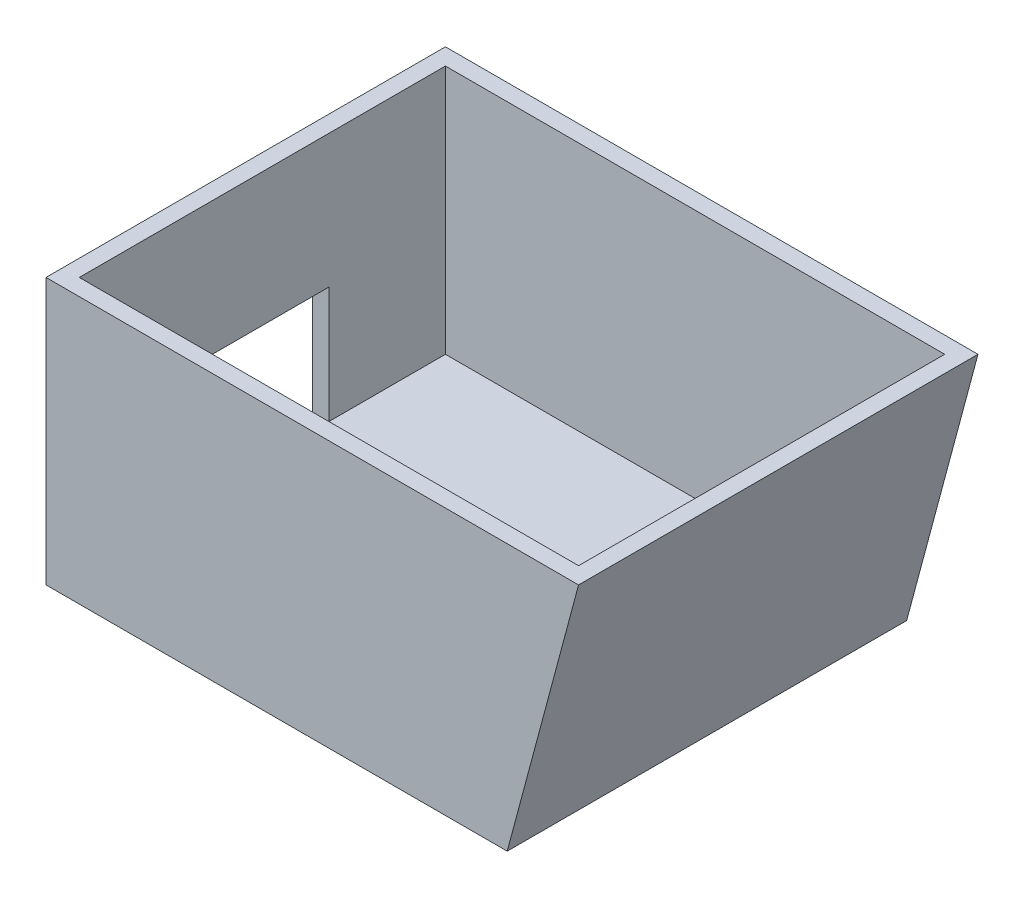
ISO-10303-21;
HEADER;
FILE_DESCRIPTION(('STEP AP214'),'2;1');
FILE_NAME('part.step','',(''),(''),'','','');
FILE_SCHEMA(('AUTOMOTIVE_DESIGN { 1 0 10303 214 1 1 1 1 }'));
ENDSEC;
DATA;
#1=APPLICATION_CONTEXT('core data for automotive mechanical design processes');
#2=APPLICATION_PROTOCOL_DEFINITION('international standard','automotive_design',2000,#1);
#3=PRODUCT_CONTEXT('',#1,'mechanical');
#4=PRODUCT('Part','Part','',(#3));
#5=PRODUCT_RELATED_PRODUCT_CATEGORY('part','',(#4));
#6=PRODUCT_DEFINITION_FORMATION('','',#4);
#7=PRODUCT_DEFINITION_CONTEXT('part definition',#1,'design');
#8=PRODUCT_DEFINITION('design','',#6,#7);
#9=PRODUCT_DEFINITION_SHAPE('','',#8);
#10=(LENGTH_UNIT() NAMED_UNIT(*) SI_UNIT(.MILLI.,.METRE.));
#11=(NAMED_UNIT(*) PLANE_ANGLE_UNIT() SI_UNIT($,.RADIAN.));
#12=(NAMED_UNIT(*) SI_UNIT($,.STERADIAN.) SOLID_ANGLE_UNIT());
#13=UNCERTAINTY_MEASURE_WITH_UNIT(LENGTH_MEASURE(1.E-05),#10,'distance_accuracy_value','');
#14=(GEOMETRIC_REPRESENTATION_CONTEXT(3) GLOBAL_UNCERTAINTY_ASSIGNED_CONTEXT((#13)) GLOBAL_UNIT_ASSIGNED_CONTEXT((#10,
#11,#12)) REPRESENTATION_CONTEXT('',''));
#15=CARTESIAN_POINT('',(0.,0.,0.));
#16=DIRECTION('',(0.,0.,1.));
#17=DIRECTION('',(1.,0.,0.));
#18=AXIS2_PLACEMENT_3D('',#15,#16,#17);
#19=CARTESIAN_POINT('',(-50.8,50.8,-38.1));
#20=DIRECTION('',(0.,0.,1.));
#21=DIRECTION('',(1.,0.,0.));
#22=AXIS2_PLACEMENT_3D('',#19,#20,#21);
#23=PLANE('',#22);
#24=DIRECTION('',(-1.,0.,0.));
#25=VECTOR('',#24,1.);
#26=CARTESIAN_POINT('',(-50.8,50.8,-38.1));
#27=LINE('',#26,#25);
#28=CARTESIAN_POINT('',(50.8,50.8,-38.1));
#29=VERTEX_POINT('',#28);
#30=CARTESIAN_POINT('',(-50.8,50.8,-38.1));
#31=VERTEX_POINT('',#30);
#32=EDGE_CURVE('E232',#29,#31,#27,.T.);
#33=ORIENTED_EDGE('',*,*,#32,.F.);
#34=DIRECTION('',(-0.258819045102521,-0.965925826289068,0.));
#35=VECTOR('',#34,1.);
#36=CARTESIAN_POINT('',(37.188181024499,0.,-38.1));
#37=LINE('',#36,#35);
#38=CARTESIAN_POINT('',(37.188181024499,0.,-38.1));
#39=VERTEX_POINT('',#38);
#40=EDGE_CURVE('E217',#29,#39,#37,.T.);
#41=ORIENTED_EDGE('',*,*,#40,.T.);
#42=DIRECTION('',(-1.,0.,0.));
#43=VECTOR('',#42,1.);
#44=CARTESIAN_POINT('',(-50.8,0.,-38.1));
#45=LINE('',#44,#43);
#46=CARTESIAN_POINT('',(-50.8,0.,-38.1));
#47=VERTEX_POINT('',#46);
#48=EDGE_CURVE('E228',#39,#47,#45,.T.);
#49=ORIENTED_EDGE('',*,*,#48,.T.);
#50=DIRECTION('',(0.,-1.,0.));
#51=VECTOR('',#50,1.);
#52=CARTESIAN_POINT('',(-50.8,50.8,-38.1));
#53=LINE('',#52,#51);
#54=EDGE_CURVE('E253',#31,#47,#53,.T.);
#55=ORIENTED_EDGE('',*,*,#54,.F.);
#56=EDGE_LOOP('',(#33,#41,#49,#55));
#57=FACE_BOUND('',#56,.T.);
#58=ADVANCED_FACE('F39',(#57),#23,.F.);
#59=CARTESIAN_POINT('',(-50.8,50.8,-38.1));
#60=DIRECTION('',(1.,0.,0.));
#61=DIRECTION('',(0.,0.,-1.));
#62=AXIS2_PLACEMENT_3D('',#59,#60,#61);
#63=PLANE('',#62);
#64=DIRECTION('',(0.,0.,-1.));
#65=VECTOR('',#64,1.);
#66=CARTESIAN_POINT('',(-50.8,25.4,12.7));
#67=LINE('',#66,#65);
#68=CARTESIAN_POINT('',(-50.8,25.4,12.7));
#69=VERTEX_POINT('',#68);
#70=CARTESIAN_POINT('',(-50.8,25.4,-12.7));
#71=VERTEX_POINT('',#70);
#72=EDGE_CURVE('E143',#69,#71,#67,.T.);
#73=ORIENTED_EDGE('',*,*,#72,.F.);
#74=DIRECTION('',(0.,-1.,0.));
#75=VECTOR('',#74,1.);
#76=CARTESIAN_POINT('',(-50.8,25.4,12.7));
#77=LINE('',#76,#75);
#78=CARTESIAN_POINT('',(-50.8,0.,12.7));
#79=VERTEX_POINT('',#78);
#80=EDGE_CURVE('E173',#69,#79,#77,.T.);
#81=ORIENTED_EDGE('',*,*,#80,.T.);
#82=DIRECTION('',(0.,0.,1.));
#83=VECTOR('',#82,1.);
#84=CARTESIAN_POINT('',(-50.8,0.,-38.1));
#85=LINE('',#84,#83);
#86=CARTESIAN_POINT('',(-50.8,0.,38.1));
#87=VERTEX_POINT('',#86);
#88=EDGE_CURVE('E245',#79,#87,#85,.T.);
#89=ORIENTED_EDGE('',*,*,#88,.T.);
#90=DIRECTION('',(0.,-1.,0.));
#91=VECTOR('',#90,1.);
#92=CARTESIAN_POINT('',(-50.8,50.8,38.1));
#93=LINE('',#92,#91);
#94=CARTESIAN_POINT('',(-50.8,50.8,38.1));
#95=VERTEX_POINT('',#94);
#96=EDGE_CURVE('E242',#95,#87,#93,.T.);
#97=ORIENTED_EDGE('',*,*,#96,.F.);
#98=DIRECTION('',(0.,0.,1.));
#99=VECTOR('',#98,1.);
#100=CARTESIAN_POINT('',(-50.8,50.8,-38.1));
#101=LINE('',#100,#99);
#102=EDGE_CURVE('E236',#31,#95,#101,.T.);
#103=ORIENTED_EDGE('',*,*,#102,.F.);
#104=ORIENTED_EDGE('',*,*,#54,.T.);
#105=CARTESIAN_POINT('',(-50.8,0.,-12.7));
#106=VERTEX_POINT('',#105);
#107=EDGE_CURVE('E158',#47,#106,#85,.T.);
#108=ORIENTED_EDGE('',*,*,#107,.T.);
#109=DIRECTION('',(0.,-1.,0.));
#110=VECTOR('',#109,1.);
#111=CARTESIAN_POINT('',(-50.8,25.4,-12.7));
#112=LINE('',#111,#110);
#113=EDGE_CURVE('E54',#71,#106,#112,.T.);
#114=ORIENTED_EDGE('',*,*,#113,.F.);
#115=EDGE_LOOP('',(#73,#81,#89,#97,#103,#104,#108,#114));
#116=FACE_BOUND('',#115,.T.);
#117=ADVANCED_FACE('F155',(#116),#63,.F.);
#118=CARTESIAN_POINT('',(-50.8,50.8,38.1));
#119=DIRECTION('',(0.,0.,-1.));
#120=DIRECTION('',(-1.,0.,0.));
#121=AXIS2_PLACEMENT_3D('',#118,#119,#120);
#122=PLANE('',#121);
#123=DIRECTION('',(1.,0.,0.));
#124=VECTOR('',#123,1.);
#125=CARTESIAN_POINT('',(-50.8,0.,38.1));
#126=LINE('',#125,#124);
#127=CARTESIAN_POINT('',(37.1881810244989,0.,38.1));
#128=VERTEX_POINT('',#127);
#129=EDGE_CURVE('E233',#87,#128,#126,.T.);
#130=ORIENTED_EDGE('',*,*,#129,.T.);
#131=DIRECTION('',(-0.258819045102521,-0.965925826289068,0.));
#132=VECTOR('',#131,1.);
#133=CARTESIAN_POINT('',(37.188181024499,0.,38.1));
#134=LINE('',#133,#132);
#135=CARTESIAN_POINT('',(50.8,50.8,38.1));
#136=VERTEX_POINT('',#135);
#137=EDGE_CURVE('E213',#136,#128,#134,.T.);
#138=ORIENTED_EDGE('',*,*,#137,.F.);
#139=DIRECTION('',(1.,0.,0.));
#140=VECTOR('',#139,1.);
#141=CARTESIAN_POINT('',(-50.8,50.8,38.1));
#142=LINE('',#141,#140);
#143=EDGE_CURVE('E239',#95,#136,#142,.T.);
#144=ORIENTED_EDGE('',*,*,#143,.F.);
#145=ORIENTED_EDGE('',*,*,#96,.T.);
#146=EDGE_LOOP('',(#130,#138,#144,#145));
#147=FACE_BOUND('',#146,.T.);
#148=ADVANCED_FACE('F305',(#147),#122,.F.);
#149=CARTESIAN_POINT('',(0.,50.8,0.));
#150=DIRECTION('',(0.,1.,0.));
#151=DIRECTION('',(0.,0.,1.));
#152=AXIS2_PLACEMENT_3D('',#149,#150,#151);
#153=PLANE('',#152);
#154=ORIENTED_EDGE('',*,*,#143,.T.);
#155=DIRECTION('',(0.,0.,-1.));
#156=VECTOR('',#155,1.);
#157=CARTESIAN_POINT('',(50.8,50.8,-38.1));
#158=LINE('',#157,#156);
#159=EDGE_CURVE('E229',#136,#29,#158,.T.);
#160=ORIENTED_EDGE('',*,*,#159,.T.);
#161=ORIENTED_EDGE('',*,*,#32,.T.);
#162=ORIENTED_EDGE('',*,*,#102,.T.);
#163=EDGE_LOOP('',(#154,#160,#161,#162));
#164=FACE_BOUND('',#163,.T.);
#165=DIRECTION('',(0.,0.,-1.));
#166=VECTOR('',#165,1.);
#167=CARTESIAN_POINT('',(47.625,50.8,34.925));
#168=LINE('',#167,#166);
#169=CARTESIAN_POINT('',(47.625,50.8,34.925));
#170=VERTEX_POINT('',#169);
#171=CARTESIAN_POINT('',(47.625,50.8,-34.925));
#172=VERTEX_POINT('',#171);
#173=EDGE_CURVE('E202',#170,#172,#168,.T.);
#174=ORIENTED_EDGE('',*,*,#173,.F.);
#175=DIRECTION('',(1.,0.,0.));
#176=VECTOR('',#175,1.);
#177=CARTESIAN_POINT('',(-47.625,50.8,34.925));
#178=LINE('',#177,#176);
#179=CARTESIAN_POINT('',(-47.625,50.8,34.925));
#180=VERTEX_POINT('',#179);
#181=EDGE_CURVE('E199',#180,#170,#178,.T.);
#182=ORIENTED_EDGE('',*,*,#181,.F.);
#183=DIRECTION('',(0.,0.,1.));
#184=VECTOR('',#183,1.);
#185=CARTESIAN_POINT('',(-47.625,50.8,-34.925));
#186=LINE('',#185,#184);
#187=CARTESIAN_POINT('',(-47.625,50.8,-34.925));
#188=VERTEX_POINT('',#187);
#189=EDGE_CURVE('E184',#188,#180,#186,.T.);
#190=ORIENTED_EDGE('',*,*,#189,.F.);
#191=DIRECTION('',(-1.,0.,0.));
#192=VECTOR('',#191,1.);
#193=CARTESIAN_POINT('',(47.625,50.8,-34.925));
#194=LINE('',#193,#192);
#195=EDGE_CURVE('E206',#172,#188,#194,.T.);
#196=ORIENTED_EDGE('',*,*,#195,.F.);
#197=EDGE_LOOP('',(#174,#182,#190,#196));
#198=FACE_BOUND('',#197,.T.);
#199=ADVANCED_FACE('F310',(#164,#198),#153,.T.);
#200=CARTESIAN_POINT('',(0.,0.,0.));
#201=DIRECTION('',(0.,1.,0.));
#202=DIRECTION('',(0.,0.,1.));
#203=AXIS2_PLACEMENT_3D('',#200,#201,#202);
#204=PLANE('',#203);
#205=ORIENTED_EDGE('',*,*,#88,.F.);
#206=DIRECTION('',(-1.,0.,0.));
#207=VECTOR('',#206,1.);
#208=CARTESIAN_POINT('',(-50.8,0.,12.7));
#209=LINE('',#208,#207);
#210=CARTESIAN_POINT('',(-25.4,0.,12.7));
#211=VERTEX_POINT('',#210);
#212=EDGE_CURVE('E152',#211,#79,#209,.T.);
#213=ORIENTED_EDGE('',*,*,#212,.F.);
#214=DIRECTION('',(0.,0.,1.));
#215=VECTOR('',#214,1.);
#216=CARTESIAN_POINT('',(-25.4,0.,12.7));
#217=LINE('',#216,#215);
#218=CARTESIAN_POINT('',(-25.4,0.,-12.7));
#219=VERTEX_POINT('',#218);
#220=EDGE_CURVE('E286',#219,#211,#217,.T.);
#221=ORIENTED_EDGE('',*,*,#220,.F.);
#222=DIRECTION('',(1.,0.,0.));
#223=VECTOR('',#222,1.);
#224=CARTESIAN_POINT('',(-50.8,0.,-12.7));
#225=LINE('',#224,#223);
#226=EDGE_CURVE('E282',#106,#219,#225,.T.);
#227=ORIENTED_EDGE('',*,*,#226,.F.);
#228=ORIENTED_EDGE('',*,*,#107,.F.);
#229=ORIENTED_EDGE('',*,*,#48,.F.);
#230=DIRECTION('',(0.,0.,1.));
#231=VECTOR('',#230,1.);
#232=CARTESIAN_POINT('',(37.188181024499,0.,-38.1));
#233=LINE('',#232,#231);
#234=EDGE_CURVE('E221',#39,#128,#233,.T.);
#235=ORIENTED_EDGE('',*,*,#234,.T.);
#236=ORIENTED_EDGE('',*,*,#129,.F.);
#237=EDGE_LOOP('',(#205,#213,#221,#227,#228,#229,#235,#236));
#238=FACE_BOUND('',#237,.T.);
#239=ADVANCED_FACE('F290',(#238),#204,.F.);
#240=CARTESIAN_POINT('',(37.188181024499,0.,-38.1));
#241=DIRECTION('',(-0.965925826289068,0.258819045102521,0.));
#242=DIRECTION('',(-0.258819045102521,-0.965925826289068,0.));
#243=AXIS2_PLACEMENT_3D('',#240,#241,#242);
#244=PLANE('',#243);
#245=ORIENTED_EDGE('',*,*,#40,.F.);
#246=ORIENTED_EDGE('',*,*,#159,.F.);
#247=ORIENTED_EDGE('',*,*,#137,.T.);
#248=ORIENTED_EDGE('',*,*,#234,.F.);
#249=EDGE_LOOP('',(#245,#246,#247,#248));
#250=FACE_BOUND('',#249,.T.);
#251=ADVANCED_FACE('F317',(#250),#244,.F.);
#252=CARTESIAN_POINT('',(47.625,3.175,-34.925));
#253=DIRECTION('',(0.,0.,-1.));
#254=DIRECTION('',(-1.,0.,0.));
#255=AXIS2_PLACEMENT_3D('',#252,#253,#254);
#256=PLANE('',#255);
#257=DIRECTION('',(-1.,0.,0.));
#258=VECTOR('',#257,1.);
#259=CARTESIAN_POINT('',(47.625,3.175,-34.925));
#260=LINE('',#259,#258);
#261=CARTESIAN_POINT('',(34.8639197104678,3.175,-34.925));
#262=VERTEX_POINT('',#261);
#263=CARTESIAN_POINT('',(-47.625,3.175,-34.925));
#264=VERTEX_POINT('',#263);
#265=EDGE_CURVE('E193',#262,#264,#260,.T.);
#266=ORIENTED_EDGE('',*,*,#265,.F.);
#267=DIRECTION('',(-0.258819045102521,-0.965925826289068,0.));
#268=VECTOR('',#267,1.);
#269=CARTESIAN_POINT('',(47.625,50.8,-34.925));
#270=LINE('',#269,#268);
#271=EDGE_CURVE('E176',#172,#262,#270,.T.);
#272=ORIENTED_EDGE('',*,*,#271,.F.);
#273=ORIENTED_EDGE('',*,*,#195,.T.);
#274=DIRECTION('',(0.,1.,0.));
#275=VECTOR('',#274,1.);
#276=CARTESIAN_POINT('',(-47.625,3.175,-34.925));
#277=LINE('',#276,#275);
#278=EDGE_CURVE('E210',#264,#188,#277,.T.);
#279=ORIENTED_EDGE('',*,*,#278,.F.);
#280=EDGE_LOOP('',(#266,#272,#273,#279));
#281=FACE_BOUND('',#280,.T.);
#282=ADVANCED_FACE('F319',(#281),#256,.F.);
#283=CARTESIAN_POINT('',(-47.625,3.175,34.925));
#284=DIRECTION('',(0.,0.,1.));
#285=DIRECTION('',(1.,0.,0.));
#286=AXIS2_PLACEMENT_3D('',#283,#284,#285);
#287=PLANE('',#286);
#288=ORIENTED_EDGE('',*,*,#181,.T.);
#289=DIRECTION('',(-0.258819045102521,-0.965925826289068,0.));
#290=VECTOR('',#289,1.);
#291=CARTESIAN_POINT('',(29.3382098552339,-17.447229927617,34.925));
#292=LINE('',#291,#290);
#293=CARTESIAN_POINT('',(34.8639197104678,3.175,34.925));
#294=VERTEX_POINT('',#293);
#295=EDGE_CURVE('E180',#170,#294,#292,.T.);
#296=ORIENTED_EDGE('',*,*,#295,.T.);
#297=DIRECTION('',(1.,0.,0.));
#298=VECTOR('',#297,1.);
#299=CARTESIAN_POINT('',(-47.625,3.175,34.925));
#300=LINE('',#299,#298);
#301=CARTESIAN_POINT('',(-47.625,3.175,34.925));
#302=VERTEX_POINT('',#301);
#303=EDGE_CURVE('E189',#302,#294,#300,.T.);
#304=ORIENTED_EDGE('',*,*,#303,.F.);
#305=DIRECTION('',(0.,1.,0.));
#306=VECTOR('',#305,1.);
#307=CARTESIAN_POINT('',(-47.625,3.175,34.925));
#308=LINE('',#307,#306);
#309=EDGE_CURVE('E196',#302,#180,#308,.T.);
#310=ORIENTED_EDGE('',*,*,#309,.T.);
#311=EDGE_LOOP('',(#288,#296,#304,#310));
#312=FACE_BOUND('',#311,.T.);
#313=ADVANCED_FACE('F325',(#312),#287,.F.);
#314=CARTESIAN_POINT('',(0.,3.175,0.));
#315=DIRECTION('',(0.,1.,0.));
#316=DIRECTION('',(0.,0.,1.));
#317=AXIS2_PLACEMENT_3D('',#314,#315,#316);
#318=PLANE('',#317);
#319=DIRECTION('',(1.,0.,0.));
#320=VECTOR('',#319,1.);
#321=CARTESIAN_POINT('',(0.,3.175,12.7));
#322=LINE('',#321,#320);
#323=CARTESIAN_POINT('',(-47.625,3.175,12.7));
#324=VERTEX_POINT('',#323);
#325=CARTESIAN_POINT('',(-25.4,3.175,12.7));
#326=VERTEX_POINT('',#325);
#327=EDGE_CURVE('E172',#324,#326,#322,.T.);
#328=ORIENTED_EDGE('',*,*,#327,.F.);
#329=DIRECTION('',(0.,0.,1.));
#330=VECTOR('',#329,1.);
#331=CARTESIAN_POINT('',(-47.625,3.175,-34.925));
#332=LINE('',#331,#330);
#333=EDGE_CURVE('E190',#324,#302,#332,.T.);
#334=ORIENTED_EDGE('',*,*,#333,.T.);
#335=ORIENTED_EDGE('',*,*,#303,.T.);
#336=DIRECTION('',(0.,0.,1.));
#337=VECTOR('',#336,1.);
#338=CARTESIAN_POINT('',(34.8639197104678,3.175,0.));
#339=LINE('',#338,#337);
#340=EDGE_CURVE('E256',#262,#294,#339,.T.);
#341=ORIENTED_EDGE('',*,*,#340,.F.);
#342=ORIENTED_EDGE('',*,*,#265,.T.);
#343=CARTESIAN_POINT('',(-47.625,3.175,-12.7));
#344=VERTEX_POINT('',#343);
#345=EDGE_CURVE('E185',#264,#344,#332,.T.);
#346=ORIENTED_EDGE('',*,*,#345,.T.);
#347=DIRECTION('',(-1.,0.,0.));
#348=VECTOR('',#347,1.);
#349=CARTESIAN_POINT('',(0.,3.175,-12.7));
#350=LINE('',#349,#348);
#351=CARTESIAN_POINT('',(-25.4,3.175,-12.7));
#352=VERTEX_POINT('',#351);
#353=EDGE_CURVE('E169',#352,#344,#350,.T.);
#354=ORIENTED_EDGE('',*,*,#353,.F.);
#355=DIRECTION('',(0.,0.,-1.));
#356=VECTOR('',#355,1.);
#357=CARTESIAN_POINT('',(-25.4,3.175,0.));
#358=LINE('',#357,#356);
#359=EDGE_CURVE('E11',#326,#352,#358,.T.);
#360=ORIENTED_EDGE('',*,*,#359,.F.);
#361=EDGE_LOOP('',(#328,#334,#335,#341,#342,#346,#354,#360));
#362=FACE_BOUND('',#361,.T.);
#363=ADVANCED_FACE('F276',(#362),#318,.T.);
#364=CARTESIAN_POINT('',(-47.625,3.175,-34.925));
#365=DIRECTION('',(-1.,0.,0.));
#366=DIRECTION('',(0.,0.,1.));
#367=AXIS2_PLACEMENT_3D('',#364,#365,#366);
#368=PLANE('',#367);
#369=ORIENTED_EDGE('',*,*,#333,.F.);
#370=DIRECTION('',(0.,1.,0.));
#371=VECTOR('',#370,1.);
#372=CARTESIAN_POINT('',(-47.625,3.175,12.7));
#373=LINE('',#372,#371);
#374=CARTESIAN_POINT('',(-47.625,25.4,12.7));
#375=VERTEX_POINT('',#374);
#376=EDGE_CURVE('E47',#324,#375,#373,.T.);
#377=ORIENTED_EDGE('',*,*,#376,.T.);
#378=DIRECTION('',(0.,0.,1.));
#379=VECTOR('',#378,1.);
#380=CARTESIAN_POINT('',(-47.625,25.4,-34.925));
#381=LINE('',#380,#379);
#382=CARTESIAN_POINT('',(-47.625,25.4,-12.7));
#383=VERTEX_POINT('',#382);
#384=EDGE_CURVE('E260',#383,#375,#381,.T.);
#385=ORIENTED_EDGE('',*,*,#384,.F.);
#386=DIRECTION('',(0.,-1.,0.));
#387=VECTOR('',#386,1.);
#388=CARTESIAN_POINT('',(-47.625,3.175,-12.7));
#389=LINE('',#388,#387);
#390=EDGE_CURVE('E139',#383,#344,#389,.T.);
#391=ORIENTED_EDGE('',*,*,#390,.T.);
#392=ORIENTED_EDGE('',*,*,#345,.F.);
#393=ORIENTED_EDGE('',*,*,#278,.T.);
#394=ORIENTED_EDGE('',*,*,#189,.T.);
#395=ORIENTED_EDGE('',*,*,#309,.F.);
#396=EDGE_LOOP('',(#369,#377,#385,#391,#392,#393,#394,#395));
#397=FACE_BOUND('',#396,.T.);
#398=ADVANCED_FACE('F268',(#397),#368,.F.);
#399=CARTESIAN_POINT('',(47.625,50.8,-34.925));
#400=DIRECTION('',(-0.965925826289068,0.258819045102521,0.));
#401=DIRECTION('',(-0.258819045102521,-0.965925826289068,0.));
#402=AXIS2_PLACEMENT_3D('',#399,#400,#401);
#403=PLANE('',#402);
#404=ORIENTED_EDGE('',*,*,#295,.F.);
#405=ORIENTED_EDGE('',*,*,#173,.T.);
#406=ORIENTED_EDGE('',*,*,#271,.T.);
#407=ORIENTED_EDGE('',*,*,#340,.T.);
#408=EDGE_LOOP('',(#404,#405,#406,#407));
#409=FACE_BOUND('',#408,.T.);
#410=ADVANCED_FACE('F371',(#409),#403,.T.);
#411=CARTESIAN_POINT('',(0.,25.4,0.));
#412=DIRECTION('',(0.,-1.,0.));
#413=DIRECTION('',(0.,0.,-1.));
#414=AXIS2_PLACEMENT_3D('',#411,#412,#413);
#415=PLANE('',#414);
#416=ORIENTED_EDGE('',*,*,#384,.T.);
#417=DIRECTION('',(-1.,0.,0.));
#418=VECTOR('',#417,1.);
#419=CARTESIAN_POINT('',(-50.8,25.4,12.7));
#420=LINE('',#419,#418);
#421=EDGE_CURVE('E142',#375,#69,#420,.T.);
#422=ORIENTED_EDGE('',*,*,#421,.T.);
#423=ORIENTED_EDGE('',*,*,#72,.T.);
#424=DIRECTION('',(1.,0.,0.));
#425=VECTOR('',#424,1.);
#426=CARTESIAN_POINT('',(-50.8,25.4,-12.7));
#427=LINE('',#426,#425);
#428=EDGE_CURVE('E61',#71,#383,#427,.T.);
#429=ORIENTED_EDGE('',*,*,#428,.T.);
#430=EDGE_LOOP('',(#416,#422,#423,#429));
#431=FACE_BOUND('',#430,.T.);
#432=ADVANCED_FACE('F146',(#431),#415,.T.);
#433=CARTESIAN_POINT('',(-50.8,25.4,12.7));
#434=DIRECTION('',(0.,0.,1.));
#435=DIRECTION('',(1.,0.,0.));
#436=AXIS2_PLACEMENT_3D('',#433,#434,#435);
#437=PLANE('',#436);
#438=ORIENTED_EDGE('',*,*,#327,.T.);
#439=DIRECTION('',(0.,-1.,0.));
#440=VECTOR('',#439,1.);
#441=CARTESIAN_POINT('',(-25.4,25.4,12.7));
#442=LINE('',#441,#440);
#443=EDGE_CURVE('E164',#326,#211,#442,.T.);
#444=ORIENTED_EDGE('',*,*,#443,.T.);
#445=ORIENTED_EDGE('',*,*,#212,.T.);
#446=ORIENTED_EDGE('',*,*,#80,.F.);
#447=ORIENTED_EDGE('',*,*,#421,.F.);
#448=ORIENTED_EDGE('',*,*,#376,.F.);
#449=EDGE_LOOP('',(#438,#444,#445,#446,#447,#448));
#450=FACE_BOUND('',#449,.T.);
#451=ADVANCED_FACE('F272',(#450),#437,.F.);
#452=CARTESIAN_POINT('',(-25.4,25.4,12.7));
#453=DIRECTION('',(1.,0.,0.));
#454=DIRECTION('',(0.,0.,-1.));
#455=AXIS2_PLACEMENT_3D('',#452,#453,#454);
#456=PLANE('',#455);
#457=ORIENTED_EDGE('',*,*,#359,.T.);
#458=DIRECTION('',(0.,-1.,0.));
#459=VECTOR('',#458,1.);
#460=CARTESIAN_POINT('',(-25.4,25.4,-12.7));
#461=LINE('',#460,#459);
#462=EDGE_CURVE('E160',#352,#219,#461,.T.);
#463=ORIENTED_EDGE('',*,*,#462,.T.);
#464=ORIENTED_EDGE('',*,*,#220,.T.);
#465=ORIENTED_EDGE('',*,*,#443,.F.);
#466=EDGE_LOOP('',(#457,#463,#464,#465));
#467=FACE_BOUND('',#466,.T.);
#468=ADVANCED_FACE('F280',(#467),#456,.F.);
#469=CARTESIAN_POINT('',(-50.8,25.4,-12.7));
#470=DIRECTION('',(0.,0.,-1.));
#471=DIRECTION('',(-1.,0.,0.));
#472=AXIS2_PLACEMENT_3D('',#469,#470,#471);
#473=PLANE('',#472);
#474=ORIENTED_EDGE('',*,*,#353,.T.);
#475=ORIENTED_EDGE('',*,*,#390,.F.);
#476=ORIENTED_EDGE('',*,*,#428,.F.);
#477=ORIENTED_EDGE('',*,*,#113,.T.);
#478=ORIENTED_EDGE('',*,*,#226,.T.);
#479=ORIENTED_EDGE('',*,*,#462,.F.);
#480=EDGE_LOOP('',(#474,#475,#476,#477,#478,#479));
#481=FACE_BOUND('',#480,.T.);
#482=ADVANCED_FACE('F137',(#481),#473,.F.);
#483=CLOSED_SHELL('',(#58,#117,#148,#199,#239,#251,#282,#313,#363,#398,#410,#432,#451,#468,#482));
#484=MANIFOLD_SOLID_BREP('B2',#483);
#485=ADVANCED_BREP_SHAPE_REPRESENTATION('',(#18,#484),#14);
#486=SHAPE_DEFINITION_REPRESENTATION(#9,#485);
ENDSEC;
END-ISO-10303-21;
